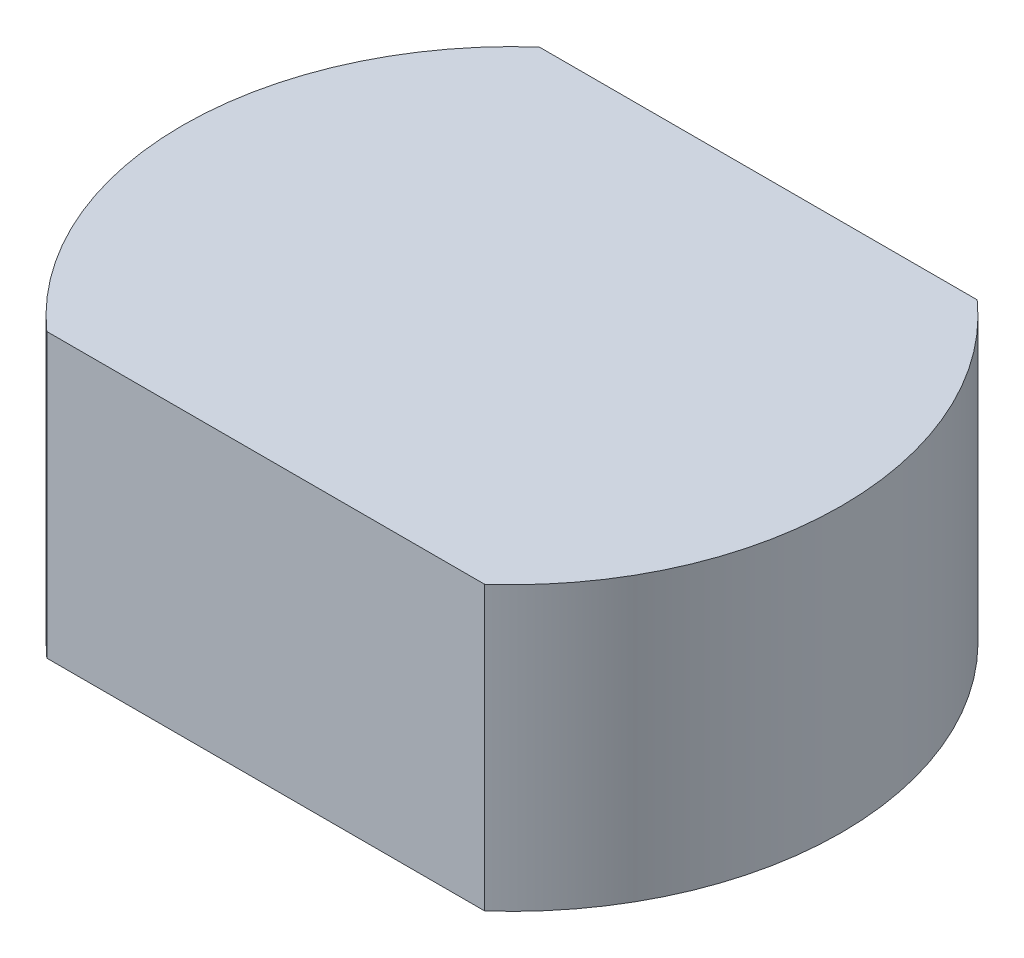
ISO-10303-21;
HEADER;
FILE_DESCRIPTION(('STEP AP214'),'2;1');
FILE_NAME('part.step','',(''),(''),'','','');
FILE_SCHEMA(('AUTOMOTIVE_DESIGN { 1 0 10303 214 1 1 1 1 }'));
ENDSEC;
DATA;
#1=APPLICATION_CONTEXT('core data for automotive mechanical design processes');
#2=APPLICATION_PROTOCOL_DEFINITION('international standard','automotive_design',2000,#1);
#3=PRODUCT_CONTEXT('',#1,'mechanical');
#4=PRODUCT('Part','Part','',(#3));
#5=PRODUCT_RELATED_PRODUCT_CATEGORY('part','',(#4));
#6=PRODUCT_DEFINITION_FORMATION('','',#4);
#7=PRODUCT_DEFINITION_CONTEXT('part definition',#1,'design');
#8=PRODUCT_DEFINITION('design','',#6,#7);
#9=PRODUCT_DEFINITION_SHAPE('','',#8);
#10=(LENGTH_UNIT() NAMED_UNIT(*) SI_UNIT(.MILLI.,.METRE.));
#11=(NAMED_UNIT(*) PLANE_ANGLE_UNIT() SI_UNIT($,.RADIAN.));
#12=(NAMED_UNIT(*) SI_UNIT($,.STERADIAN.) SOLID_ANGLE_UNIT());
#13=UNCERTAINTY_MEASURE_WITH_UNIT(LENGTH_MEASURE(1.E-05),#10,'distance_accuracy_value','');
#14=(GEOMETRIC_REPRESENTATION_CONTEXT(3) GLOBAL_UNCERTAINTY_ASSIGNED_CONTEXT((#13)) GLOBAL_UNIT_ASSIGNED_CONTEXT((#10,
#11,#12)) REPRESENTATION_CONTEXT('',''));
#15=CARTESIAN_POINT('',(0.,0.,0.));
#16=DIRECTION('',(0.,0.,1.));
#17=DIRECTION('',(1.,0.,0.));
#18=AXIS2_PLACEMENT_3D('',#15,#16,#17);
#19=CARTESIAN_POINT('',(0.,-37.15,-10.05));
#20=DIRECTION('',(0.,-1.,0.));
#21=DIRECTION('',(1.,0.,0.));
#22=AXIS2_PLACEMENT_3D('',#19,#20,#21);
#23=PLANE('',#22);
#24=CARTESIAN_POINT('',(0.,-37.15,-10.05));
#25=DIRECTION('',(0.,-1.,0.));
#26=DIRECTION('',(1.,0.,0.));
#27=AXIS2_PLACEMENT_3D('',#24,#25,#26);
#28=CIRCLE('',#27,9.9);
#29=CARTESIAN_POINT('',(6.57647321898295,-37.15,-17.45));
#30=VERTEX_POINT('',#29);
#31=CARTESIAN_POINT('',(6.57647321898295,-37.15,-2.65));
#32=VERTEX_POINT('',#31);
#33=EDGE_CURVE('E66',#30,#32,#28,.T.);
#34=ORIENTED_EDGE('',*,*,#33,.F.);
#35=DIRECTION('',(1.,0.,0.));
#36=VECTOR('',#35,1.);
#37=CARTESIAN_POINT('',(-2.37912975920678,-37.15,-17.45));
#38=LINE('',#37,#36);
#39=CARTESIAN_POINT('',(-6.57647321898296,-37.15,-17.45));
#40=VERTEX_POINT('',#39);
#41=EDGE_CURVE('E64',#30,#40,#38,.F.);
#42=ORIENTED_EDGE('',*,*,#41,.T.);
#43=CARTESIAN_POINT('',(0.,-37.15,-10.05));
#44=DIRECTION('',(0.,-1.,0.));
#45=DIRECTION('',(1.,0.,0.));
#46=AXIS2_PLACEMENT_3D('',#43,#44,#45);
#47=CIRCLE('',#46,9.9);
#48=CARTESIAN_POINT('',(-6.57647321898296,-37.15,-2.65));
#49=VERTEX_POINT('',#48);
#50=EDGE_CURVE('E19',#49,#40,#47,.T.);
#51=ORIENTED_EDGE('',*,*,#50,.F.);
#52=DIRECTION('',(1.,0.,0.));
#53=VECTOR('',#52,1.);
#54=CARTESIAN_POINT('',(0.,-37.15,-2.65));
#55=LINE('',#54,#53);
#56=EDGE_CURVE('E63',#32,#49,#55,.F.);
#57=ORIENTED_EDGE('',*,*,#56,.F.);
#58=EDGE_LOOP('',(#34,#42,#51,#57));
#59=FACE_BOUND('',#58,.T.);
#60=ADVANCED_FACE('F16',(#59),#23,.F.);
#61=CARTESIAN_POINT('',(0.,-45.65,-2.65));
#62=DIRECTION('',(0.,0.,1.));
#63=DIRECTION('',(1.,0.,0.));
#64=AXIS2_PLACEMENT_3D('',#61,#62,#63);
#65=PLANE('',#64);
#66=DIRECTION('',(1.,0.,0.));
#67=VECTOR('',#66,1.);
#68=CARTESIAN_POINT('',(0.,-45.65,-2.65));
#69=LINE('',#68,#67);
#70=CARTESIAN_POINT('',(6.57647321898295,-45.65,-2.65));
#71=VERTEX_POINT('',#70);
#72=CARTESIAN_POINT('',(-6.57647321898296,-45.65,-2.65));
#73=VERTEX_POINT('',#72);
#74=EDGE_CURVE('E78',#71,#73,#69,.F.);
#75=ORIENTED_EDGE('',*,*,#74,.F.);
#76=DIRECTION('',(0.,-1.,0.));
#77=VECTOR('',#76,1.);
#78=CARTESIAN_POINT('',(6.57647321898295,-45.65,-2.65));
#79=LINE('',#78,#77);
#80=EDGE_CURVE('E79',#32,#71,#79,.T.);
#81=ORIENTED_EDGE('',*,*,#80,.F.);
#82=ORIENTED_EDGE('',*,*,#56,.T.);
#83=DIRECTION('',(0.,-1.,0.));
#84=VECTOR('',#83,1.);
#85=CARTESIAN_POINT('',(-6.57647321898296,-45.65,-2.65));
#86=LINE('',#85,#84);
#87=EDGE_CURVE('E62',#73,#49,#86,.F.);
#88=ORIENTED_EDGE('',*,*,#87,.F.);
#89=EDGE_LOOP('',(#75,#81,#82,#88));
#90=FACE_BOUND('',#89,.T.);
#91=ADVANCED_FACE('F89',(#90),#65,.T.);
#92=CARTESIAN_POINT('',(0.,-45.65,-10.05));
#93=DIRECTION('',(0.,-1.,0.));
#94=DIRECTION('',(1.,0.,0.));
#95=AXIS2_PLACEMENT_3D('',#92,#93,#94);
#96=CYLINDRICAL_SURFACE('',#95,9.9);
#97=CARTESIAN_POINT('',(0.,-45.65,-10.05));
#98=DIRECTION('',(0.,-1.,0.));
#99=DIRECTION('',(1.,0.,0.));
#100=AXIS2_PLACEMENT_3D('',#97,#98,#99);
#101=CIRCLE('',#100,9.9);
#102=CARTESIAN_POINT('',(-6.57647321898296,-45.65,-17.45));
#103=VERTEX_POINT('',#102);
#104=EDGE_CURVE('E77',#73,#103,#101,.T.);
#105=ORIENTED_EDGE('',*,*,#104,.F.);
#106=ORIENTED_EDGE('',*,*,#87,.T.);
#107=ORIENTED_EDGE('',*,*,#50,.T.);
#108=DIRECTION('',(0.,1.,0.));
#109=VECTOR('',#108,1.);
#110=CARTESIAN_POINT('',(-6.57647321898296,-45.65,-17.45));
#111=LINE('',#110,#109);
#112=EDGE_CURVE('E61',#40,#103,#111,.F.);
#113=ORIENTED_EDGE('',*,*,#112,.T.);
#114=EDGE_LOOP('',(#105,#106,#107,#113));
#115=FACE_BOUND('',#114,.T.);
#116=ADVANCED_FACE('F59',(#115),#96,.T.);
#117=CARTESIAN_POINT('',(-2.37912975920678,-45.65,-17.45));
#118=DIRECTION('',(0.,0.,1.));
#119=DIRECTION('',(1.,0.,0.));
#120=AXIS2_PLACEMENT_3D('',#117,#118,#119);
#121=PLANE('',#120);
#122=DIRECTION('',(0.,-1.,0.));
#123=VECTOR('',#122,1.);
#124=CARTESIAN_POINT('',(6.57647321898295,-45.65,-17.45));
#125=LINE('',#124,#123);
#126=CARTESIAN_POINT('',(6.57647321898295,-45.65,-17.45));
#127=VERTEX_POINT('',#126);
#128=EDGE_CURVE('E34',#127,#30,#125,.F.);
#129=ORIENTED_EDGE('',*,*,#128,.F.);
#130=DIRECTION('',(1.,0.,0.));
#131=VECTOR('',#130,1.);
#132=CARTESIAN_POINT('',(0.,-45.65,-17.45));
#133=LINE('',#132,#131);
#134=EDGE_CURVE('E25',#103,#127,#133,.T.);
#135=ORIENTED_EDGE('',*,*,#134,.F.);
#136=ORIENTED_EDGE('',*,*,#112,.F.);
#137=ORIENTED_EDGE('',*,*,#41,.F.);
#138=EDGE_LOOP('',(#129,#135,#136,#137));
#139=FACE_BOUND('',#138,.T.);
#140=ADVANCED_FACE('F68',(#139),#121,.F.);
#141=CARTESIAN_POINT('',(0.,-45.65,-10.05));
#142=DIRECTION('',(0.,-1.,0.));
#143=DIRECTION('',(1.,0.,0.));
#144=AXIS2_PLACEMENT_3D('',#141,#142,#143);
#145=CYLINDRICAL_SURFACE('',#144,9.9);
#146=CARTESIAN_POINT('',(0.,-45.65,-10.05));
#147=DIRECTION('',(0.,-1.,0.));
#148=DIRECTION('',(1.,0.,0.));
#149=AXIS2_PLACEMENT_3D('',#146,#147,#148);
#150=CIRCLE('',#149,9.9);
#151=EDGE_CURVE('E11',#127,#71,#150,.T.);
#152=ORIENTED_EDGE('',*,*,#151,.F.);
#153=ORIENTED_EDGE('',*,*,#128,.T.);
#154=ORIENTED_EDGE('',*,*,#33,.T.);
#155=ORIENTED_EDGE('',*,*,#80,.T.);
#156=EDGE_LOOP('',(#152,#153,#154,#155));
#157=FACE_BOUND('',#156,.T.);
#158=ADVANCED_FACE('F98',(#157),#145,.T.);
#159=CARTESIAN_POINT('',(0.,-45.65,-10.05));
#160=DIRECTION('',(0.,-1.,0.));
#161=DIRECTION('',(1.,0.,0.));
#162=AXIS2_PLACEMENT_3D('',#159,#160,#161);
#163=PLANE('',#162);
#164=ORIENTED_EDGE('',*,*,#134,.T.);
#165=ORIENTED_EDGE('',*,*,#151,.T.);
#166=ORIENTED_EDGE('',*,*,#74,.T.);
#167=ORIENTED_EDGE('',*,*,#104,.T.);
#168=EDGE_LOOP('',(#164,#165,#166,#167));
#169=FACE_BOUND('',#168,.T.);
#170=ADVANCED_FACE('F87',(#169),#163,.T.);
#171=CLOSED_SHELL('',(#60,#91,#116,#140,#158,#170));
#172=MANIFOLD_SOLID_BREP('B1',#171);
#173=ADVANCED_BREP_SHAPE_REPRESENTATION('',(#18,#172),#14);
#174=SHAPE_DEFINITION_REPRESENTATION(#9,#173);
ENDSEC;
END-ISO-10303-21;
